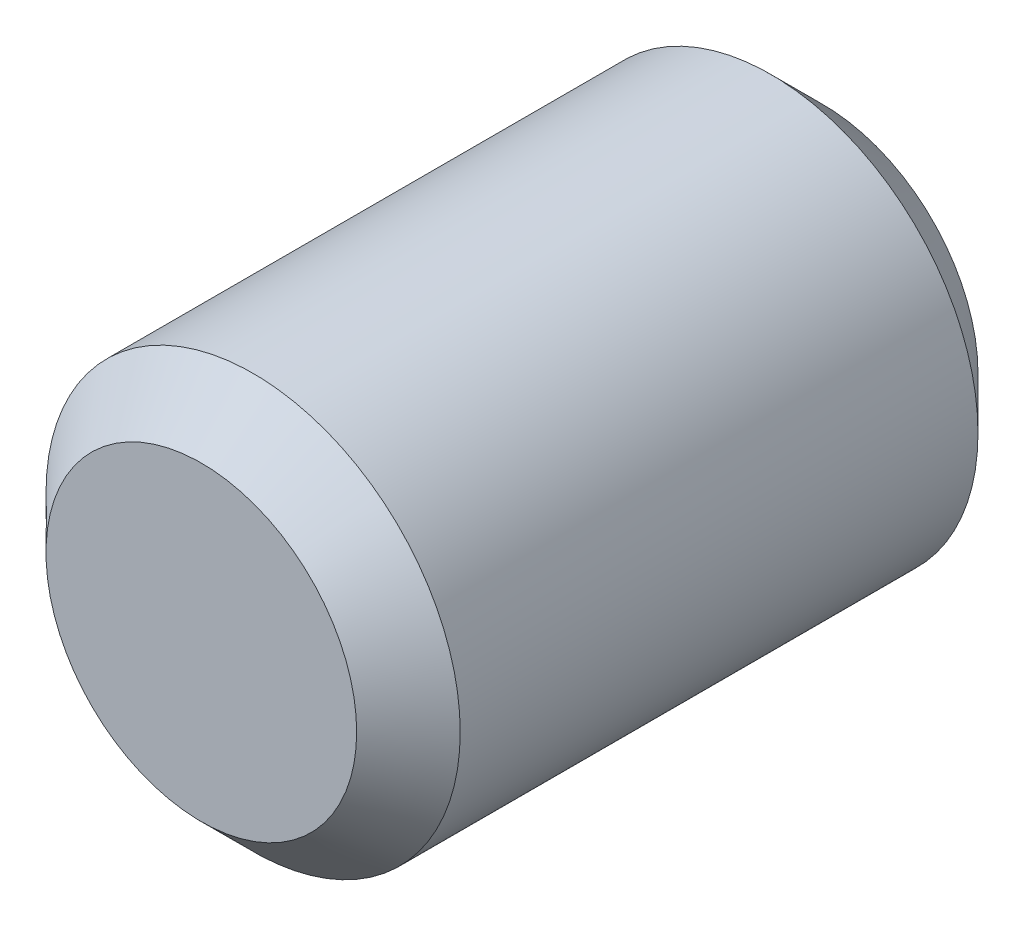
ISO-10303-21;
HEADER;
FILE_DESCRIPTION(('STEP AP214'),'2;1');
FILE_NAME('part.step','',(''),(''),'','','');
FILE_SCHEMA(('AUTOMOTIVE_DESIGN { 1 0 10303 214 1 1 1 1 }'));
ENDSEC;
DATA;
#1=APPLICATION_CONTEXT('core data for automotive mechanical design processes');
#2=APPLICATION_PROTOCOL_DEFINITION('international standard','automotive_design',2000,#1);
#3=PRODUCT_CONTEXT('',#1,'mechanical');
#4=PRODUCT('Part','Part','',(#3));
#5=PRODUCT_RELATED_PRODUCT_CATEGORY('part','',(#4));
#6=PRODUCT_DEFINITION_FORMATION('','',#4);
#7=PRODUCT_DEFINITION_CONTEXT('part definition',#1,'design');
#8=PRODUCT_DEFINITION('design','',#6,#7);
#9=PRODUCT_DEFINITION_SHAPE('','',#8);
#10=(LENGTH_UNIT() NAMED_UNIT(*) SI_UNIT(.MILLI.,.METRE.));
#11=(NAMED_UNIT(*) PLANE_ANGLE_UNIT() SI_UNIT($,.RADIAN.));
#12=(NAMED_UNIT(*) SI_UNIT($,.STERADIAN.) SOLID_ANGLE_UNIT());
#13=UNCERTAINTY_MEASURE_WITH_UNIT(LENGTH_MEASURE(1.E-05),#10,'distance_accuracy_value','');
#14=(GEOMETRIC_REPRESENTATION_CONTEXT(3) GLOBAL_UNCERTAINTY_ASSIGNED_CONTEXT((#13)) GLOBAL_UNIT_ASSIGNED_CONTEXT((#10,
#11,#12)) REPRESENTATION_CONTEXT('',''));
#15=CARTESIAN_POINT('',(0.,0.,0.));
#16=DIRECTION('',(0.,0.,1.));
#17=DIRECTION('',(1.,0.,0.));
#18=AXIS2_PLACEMENT_3D('',#15,#16,#17);
#19=CARTESIAN_POINT('',(0.,0.,1.5));
#20=DIRECTION('',(0.,0.,-1.));
#21=DIRECTION('',(-1.,0.,0.));
#22=AXIS2_PLACEMENT_3D('',#19,#20,#21);
#23=CYLINDRICAL_SURFACE('',#22,0.999999999999999);
#24=CARTESIAN_POINT('',(0.,0.,-1.25));
#25=DIRECTION('',(0.,0.,1.));
#26=DIRECTION('',(1.,0.,0.));
#27=AXIS2_PLACEMENT_3D('',#24,#25,#26);
#28=CIRCLE('',#27,0.999999999999999);
#29=CARTESIAN_POINT('',(0.999999999999999,0.,-1.25));
#30=VERTEX_POINT('',#29);
#31=EDGE_CURVE('E42',#30,#30,#28,.T.);
#32=ORIENTED_EDGE('',*,*,#31,.T.);
#33=EDGE_LOOP('',(#32));
#34=FACE_BOUND('',#33,.T.);
#35=CARTESIAN_POINT('',(0.,0.,1.25));
#36=DIRECTION('',(0.,0.,1.));
#37=DIRECTION('',(1.,0.,0.));
#38=AXIS2_PLACEMENT_3D('',#35,#36,#37);
#39=CIRCLE('',#38,0.999999999999999);
#40=CARTESIAN_POINT('',(0.999999999999999,0.,1.25));
#41=VERTEX_POINT('',#40);
#42=EDGE_CURVE('E46',#41,#41,#39,.F.);
#43=ORIENTED_EDGE('',*,*,#42,.T.);
#44=EDGE_LOOP('',(#43));
#45=FACE_BOUND('',#44,.T.);
#46=ADVANCED_FACE('F31',(#34,#45),#23,.T.);
#47=CARTESIAN_POINT('',(0.,0.,1.5));
#48=DIRECTION('',(0.,0.,1.));
#49=DIRECTION('',(1.,0.,0.));
#50=AXIS2_PLACEMENT_3D('',#47,#48,#49);
#51=PLANE('',#50);
#52=CARTESIAN_POINT('',(0.,0.,1.5));
#53=DIRECTION('',(0.,0.,1.));
#54=DIRECTION('',(1.,0.,0.));
#55=AXIS2_PLACEMENT_3D('',#52,#53,#54);
#56=CIRCLE('',#55,0.749999999999998);
#57=CARTESIAN_POINT('',(0.749999999999998,0.,1.5));
#58=VERTEX_POINT('',#57);
#59=EDGE_CURVE('E10',#58,#58,#56,.T.);
#60=ORIENTED_EDGE('',*,*,#59,.T.);
#61=EDGE_LOOP('',(#60));
#62=FACE_BOUND('',#61,.T.);
#63=ADVANCED_FACE('F62',(#62),#51,.T.);
#64=CARTESIAN_POINT('',(0.,0.,-1.5));
#65=DIRECTION('',(0.,0.,1.));
#66=DIRECTION('',(1.,0.,0.));
#67=AXIS2_PLACEMENT_3D('',#64,#65,#66);
#68=PLANE('',#67);
#69=CARTESIAN_POINT('',(0.,0.,-1.5));
#70=DIRECTION('',(0.,0.,1.));
#71=DIRECTION('',(1.,0.,0.));
#72=AXIS2_PLACEMENT_3D('',#69,#70,#71);
#73=CIRCLE('',#72,0.749999999999999);
#74=CARTESIAN_POINT('',(0.749999999999999,0.,-1.5));
#75=VERTEX_POINT('',#74);
#76=EDGE_CURVE('E38',#75,#75,#73,.F.);
#77=ORIENTED_EDGE('',*,*,#76,.T.);
#78=EDGE_LOOP('',(#77));
#79=FACE_BOUND('',#78,.T.);
#80=ADVANCED_FACE('F59',(#79),#68,.F.);
#81=CARTESIAN_POINT('',(0.,0.,-1.25));
#82=DIRECTION('',(0.,0.,1.));
#83=DIRECTION('',(1.,0.,0.));
#84=AXIS2_PLACEMENT_3D('',#81,#82,#83);
#85=CONICAL_SURFACE('',#84,0.999999999999999,0.785398163397449);
#86=ORIENTED_EDGE('',*,*,#76,.F.);
#87=EDGE_LOOP('',(#86));
#88=FACE_BOUND('',#87,.T.);
#89=ORIENTED_EDGE('',*,*,#31,.F.);
#90=EDGE_LOOP('',(#89));
#91=FACE_BOUND('',#90,.T.);
#92=ADVANCED_FACE('F55',(#88,#91),#85,.T.);
#93=CARTESIAN_POINT('',(0.,0.,1.5));
#94=DIRECTION('',(0.,0.,-1.));
#95=DIRECTION('',(-1.,0.,0.));
#96=AXIS2_PLACEMENT_3D('',#93,#94,#95);
#97=CONICAL_SURFACE('',#96,0.749999999999998,0.785398163397447);
#98=ORIENTED_EDGE('',*,*,#42,.F.);
#99=EDGE_LOOP('',(#98));
#100=FACE_BOUND('',#99,.T.);
#101=ORIENTED_EDGE('',*,*,#59,.F.);
#102=EDGE_LOOP('',(#101));
#103=FACE_BOUND('',#102,.T.);
#104=ADVANCED_FACE('F33',(#100,#103),#97,.T.);
#105=CLOSED_SHELL('',(#46,#63,#80,#92,#104));
#106=MANIFOLD_SOLID_BREP('B2',#105);
#107=ADVANCED_BREP_SHAPE_REPRESENTATION('',(#18,#106),#14);
#108=SHAPE_DEFINITION_REPRESENTATION(#9,#107);
ENDSEC;
END-ISO-10303-21;
